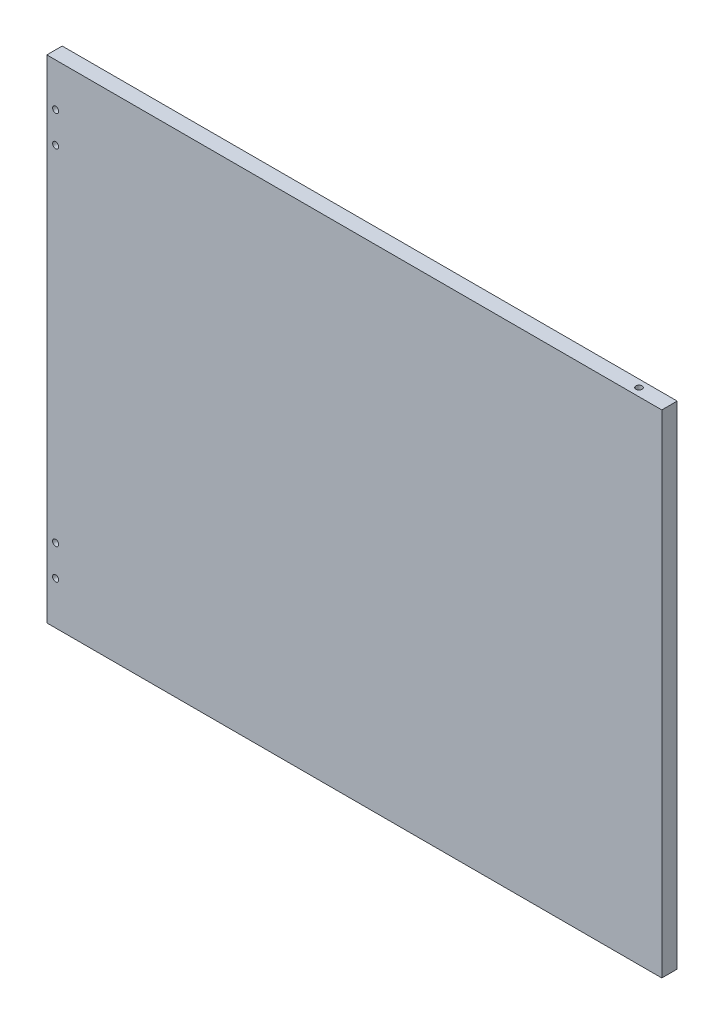
ISO-10303-21;
HEADER;
FILE_DESCRIPTION(('STEP AP214'),'2;1');
FILE_NAME('part.step','',(''),(''),'','','');
FILE_SCHEMA(('AUTOMOTIVE_DESIGN { 1 0 10303 214 1 1 1 1 }'));
ENDSEC;
DATA;
#1=APPLICATION_CONTEXT('core data for automotive mechanical design processes');
#2=APPLICATION_PROTOCOL_DEFINITION('international standard','automotive_design',2000,#1);
#3=PRODUCT_CONTEXT('',#1,'mechanical');
#4=PRODUCT('Part','Part','',(#3));
#5=PRODUCT_RELATED_PRODUCT_CATEGORY('part','',(#4));
#6=PRODUCT_DEFINITION_FORMATION('','',#4);
#7=PRODUCT_DEFINITION_CONTEXT('part definition',#1,'design');
#8=PRODUCT_DEFINITION('design','',#6,#7);
#9=PRODUCT_DEFINITION_SHAPE('','',#8);
#10=(LENGTH_UNIT() NAMED_UNIT(*) SI_UNIT(.MILLI.,.METRE.));
#11=(NAMED_UNIT(*) PLANE_ANGLE_UNIT() SI_UNIT($,.RADIAN.));
#12=(NAMED_UNIT(*) SI_UNIT($,.STERADIAN.) SOLID_ANGLE_UNIT());
#13=UNCERTAINTY_MEASURE_WITH_UNIT(LENGTH_MEASURE(1.E-05),#10,'distance_accuracy_value','');
#14=(GEOMETRIC_REPRESENTATION_CONTEXT(3) GLOBAL_UNCERTAINTY_ASSIGNED_CONTEXT((#13)) GLOBAL_UNIT_ASSIGNED_CONTEXT((#10,
#11,#12)) REPRESENTATION_CONTEXT('',''));
#15=CARTESIAN_POINT('',(0.,0.,0.));
#16=DIRECTION('',(0.,0.,1.));
#17=DIRECTION('',(1.,0.,0.));
#18=AXIS2_PLACEMENT_3D('',#15,#16,#17);
#19=CARTESIAN_POINT('',(0.,0.,25.));
#20=DIRECTION('',(1.,0.,0.));
#21=DIRECTION('',(0.,0.,-1.));
#22=AXIS2_PLACEMENT_3D('',#19,#20,#21);
#23=PLANE('',#22);
#24=DIRECTION('',(0.,-1.,0.));
#25=VECTOR('',#24,1.);
#26=CARTESIAN_POINT('',(0.,0.,0.));
#27=LINE('',#26,#25);
#28=CARTESIAN_POINT('',(0.,800.,0.));
#29=VERTEX_POINT('',#28);
#30=CARTESIAN_POINT('',(0.,0.,0.));
#31=VERTEX_POINT('',#30);
#32=EDGE_CURVE('E95',#29,#31,#27,.T.);
#33=ORIENTED_EDGE('',*,*,#32,.T.);
#34=DIRECTION('',(0.,0.,-1.));
#35=VECTOR('',#34,1.);
#36=CARTESIAN_POINT('',(0.,0.,25.));
#37=LINE('',#36,#35);
#38=CARTESIAN_POINT('',(0.,0.,25.));
#39=VERTEX_POINT('',#38);
#40=EDGE_CURVE('E11',#39,#31,#37,.T.);
#41=ORIENTED_EDGE('',*,*,#40,.F.);
#42=DIRECTION('',(0.,-1.,0.));
#43=VECTOR('',#42,1.);
#44=CARTESIAN_POINT('',(0.,0.,25.));
#45=LINE('',#44,#43);
#46=CARTESIAN_POINT('',(0.,800.,25.));
#47=VERTEX_POINT('',#46);
#48=EDGE_CURVE('E83',#47,#39,#45,.T.);
#49=ORIENTED_EDGE('',*,*,#48,.F.);
#50=DIRECTION('',(0.,0.,-1.));
#51=VECTOR('',#50,1.);
#52=CARTESIAN_POINT('',(0.,800.,25.));
#53=LINE('',#52,#51);
#54=EDGE_CURVE('E91',#47,#29,#53,.T.);
#55=ORIENTED_EDGE('',*,*,#54,.T.);
#56=EDGE_LOOP('',(#33,#41,#49,#55));
#57=FACE_BOUND('',#56,.T.);
#58=ADVANCED_FACE('F32',(#57),#23,.F.);
#59=CARTESIAN_POINT('',(0.,0.,25.));
#60=DIRECTION('',(0.,1.,0.));
#61=DIRECTION('',(0.,0.,1.));
#62=AXIS2_PLACEMENT_3D('',#59,#60,#61);
#63=PLANE('',#62);
#64=CARTESIAN_POINT('',(950.,0.,12.));
#65=DIRECTION('',(0.,1.,0.));
#66=DIRECTION('',(0.,0.,1.));
#67=AXIS2_PLACEMENT_3D('',#64,#65,#66);
#68=CIRCLE('',#67,5.00000000000004);
#69=CARTESIAN_POINT('',(950.,0.,17.));
#70=VERTEX_POINT('',#69);
#71=EDGE_CURVE('E133',#70,#70,#68,.T.);
#72=ORIENTED_EDGE('',*,*,#71,.T.);
#73=EDGE_LOOP('',(#72));
#74=FACE_BOUND('',#73,.T.);
#75=DIRECTION('',(1.,0.,0.));
#76=VECTOR('',#75,1.);
#77=CARTESIAN_POINT('',(0.,0.,0.));
#78=LINE('',#77,#76);
#79=CARTESIAN_POINT('',(1000.,0.,0.));
#80=VERTEX_POINT('',#79);
#81=EDGE_CURVE('E87',#31,#80,#78,.T.);
#82=ORIENTED_EDGE('',*,*,#81,.T.);
#83=DIRECTION('',(0.,0.,-1.));
#84=VECTOR('',#83,1.);
#85=CARTESIAN_POINT('',(1000.,0.,25.));
#86=LINE('',#85,#84);
#87=CARTESIAN_POINT('',(1000.,0.,25.));
#88=VERTEX_POINT('',#87);
#89=EDGE_CURVE('E40',#88,#80,#86,.T.);
#90=ORIENTED_EDGE('',*,*,#89,.F.);
#91=DIRECTION('',(1.,0.,0.));
#92=VECTOR('',#91,1.);
#93=CARTESIAN_POINT('',(0.,0.,25.));
#94=LINE('',#93,#92);
#95=EDGE_CURVE('E78',#39,#88,#94,.T.);
#96=ORIENTED_EDGE('',*,*,#95,.F.);
#97=ORIENTED_EDGE('',*,*,#40,.T.);
#98=EDGE_LOOP('',(#82,#90,#96,#97));
#99=FACE_BOUND('',#98,.T.);
#100=ADVANCED_FACE('F86',(#74,#99),#63,.F.);
#101=CARTESIAN_POINT('',(1000.,0.,25.));
#102=DIRECTION('',(-1.,0.,0.));
#103=DIRECTION('',(0.,0.,1.));
#104=AXIS2_PLACEMENT_3D('',#101,#102,#103);
#105=PLANE('',#104);
#106=DIRECTION('',(0.,1.,0.));
#107=VECTOR('',#106,1.);
#108=CARTESIAN_POINT('',(1000.,0.,0.));
#109=LINE('',#108,#107);
#110=CARTESIAN_POINT('',(1000.,800.,0.));
#111=VERTEX_POINT('',#110);
#112=EDGE_CURVE('E65',#80,#111,#109,.T.);
#113=ORIENTED_EDGE('',*,*,#112,.T.);
#114=DIRECTION('',(0.,0.,-1.));
#115=VECTOR('',#114,1.);
#116=CARTESIAN_POINT('',(1000.,800.,25.));
#117=LINE('',#116,#115);
#118=CARTESIAN_POINT('',(1000.,800.,25.));
#119=VERTEX_POINT('',#118);
#120=EDGE_CURVE('E88',#119,#111,#117,.T.);
#121=ORIENTED_EDGE('',*,*,#120,.F.);
#122=DIRECTION('',(0.,1.,0.));
#123=VECTOR('',#122,1.);
#124=CARTESIAN_POINT('',(1000.,0.,25.));
#125=LINE('',#124,#123);
#126=EDGE_CURVE('E81',#88,#119,#125,.T.);
#127=ORIENTED_EDGE('',*,*,#126,.F.);
#128=ORIENTED_EDGE('',*,*,#89,.T.);
#129=EDGE_LOOP('',(#113,#121,#127,#128));
#130=FACE_BOUND('',#129,.T.);
#131=ADVANCED_FACE('F89',(#130),#105,.F.);
#132=CARTESIAN_POINT('',(0.,800.,25.));
#133=DIRECTION('',(0.,-1.,0.));
#134=DIRECTION('',(0.,0.,-1.));
#135=AXIS2_PLACEMENT_3D('',#132,#133,#134);
#136=PLANE('',#135);
#137=CARTESIAN_POINT('',(950.,800.,12.));
#138=DIRECTION('',(0.,1.,0.));
#139=DIRECTION('',(0.,0.,1.));
#140=AXIS2_PLACEMENT_3D('',#137,#138,#139);
#141=CIRCLE('',#140,5.00000000000004);
#142=CARTESIAN_POINT('',(950.,800.,17.));
#143=VERTEX_POINT('',#142);
#144=EDGE_CURVE('E139',#143,#143,#141,.T.);
#145=ORIENTED_EDGE('',*,*,#144,.F.);
#146=EDGE_LOOP('',(#145));
#147=FACE_BOUND('',#146,.T.);
#148=DIRECTION('',(-1.,0.,0.));
#149=VECTOR('',#148,1.);
#150=CARTESIAN_POINT('',(0.,800.,0.));
#151=LINE('',#150,#149);
#152=EDGE_CURVE('E71',#111,#29,#151,.T.);
#153=ORIENTED_EDGE('',*,*,#152,.T.);
#154=ORIENTED_EDGE('',*,*,#54,.F.);
#155=DIRECTION('',(-1.,0.,0.));
#156=VECTOR('',#155,1.);
#157=CARTESIAN_POINT('',(0.,800.,25.));
#158=LINE('',#157,#156);
#159=EDGE_CURVE('E48',#119,#47,#158,.T.);
#160=ORIENTED_EDGE('',*,*,#159,.F.);
#161=ORIENTED_EDGE('',*,*,#120,.T.);
#162=EDGE_LOOP('',(#153,#154,#160,#161));
#163=FACE_BOUND('',#162,.T.);
#164=ADVANCED_FACE('F103',(#147,#163),#136,.F.);
#165=CARTESIAN_POINT('',(0.,0.,25.));
#166=DIRECTION('',(0.,0.,-1.));
#167=DIRECTION('',(-1.,0.,0.));
#168=AXIS2_PLACEMENT_3D('',#165,#166,#167);
#169=PLANE('',#168);
#170=CARTESIAN_POINT('',(14.35,730.,25.));
#171=DIRECTION('',(0.,0.,1.));
#172=DIRECTION('',(1.,0.,0.));
#173=AXIS2_PLACEMENT_3D('',#170,#171,#172);
#174=CIRCLE('',#173,5.00000000000001);
#175=CARTESIAN_POINT('',(19.35,730.,25.));
#176=VERTEX_POINT('',#175);
#177=EDGE_CURVE('E98',#176,#176,#174,.T.);
#178=ORIENTED_EDGE('',*,*,#177,.F.);
#179=EDGE_LOOP('',(#178));
#180=FACE_BOUND('',#179,.T.);
#181=CARTESIAN_POINT('',(14.35,120.,25.));
#182=DIRECTION('',(0.,0.,1.));
#183=DIRECTION('',(1.,0.,0.));
#184=AXIS2_PLACEMENT_3D('',#181,#182,#183);
#185=CIRCLE('',#184,5.00000000000001);
#186=CARTESIAN_POINT('',(19.35,120.,25.));
#187=VERTEX_POINT('',#186);
#188=EDGE_CURVE('E113',#187,#187,#185,.T.);
#189=ORIENTED_EDGE('',*,*,#188,.F.);
#190=EDGE_LOOP('',(#189));
#191=FACE_BOUND('',#190,.T.);
#192=CARTESIAN_POINT('',(14.35,70.,25.));
#193=DIRECTION('',(0.,0.,1.));
#194=DIRECTION('',(1.,0.,0.));
#195=AXIS2_PLACEMENT_3D('',#192,#193,#194);
#196=CIRCLE('',#195,5.00000000000001);
#197=CARTESIAN_POINT('',(19.35,70.,25.));
#198=VERTEX_POINT('',#197);
#199=EDGE_CURVE('E112',#198,#198,#196,.T.);
#200=ORIENTED_EDGE('',*,*,#199,.F.);
#201=EDGE_LOOP('',(#200));
#202=FACE_BOUND('',#201,.T.);
#203=CARTESIAN_POINT('',(14.3500000000001,680.,25.));
#204=DIRECTION('',(0.,0.,1.));
#205=DIRECTION('',(1.,0.,0.));
#206=AXIS2_PLACEMENT_3D('',#203,#204,#205);
#207=CIRCLE('',#206,5.00000000000001);
#208=CARTESIAN_POINT('',(19.3500000000001,680.,25.));
#209=VERTEX_POINT('',#208);
#210=EDGE_CURVE('E119',#209,#209,#207,.T.);
#211=ORIENTED_EDGE('',*,*,#210,.F.);
#212=EDGE_LOOP('',(#211));
#213=FACE_BOUND('',#212,.T.);
#214=ORIENTED_EDGE('',*,*,#48,.T.);
#215=ORIENTED_EDGE('',*,*,#95,.T.);
#216=ORIENTED_EDGE('',*,*,#126,.T.);
#217=ORIENTED_EDGE('',*,*,#159,.T.);
#218=EDGE_LOOP('',(#214,#215,#216,#217));
#219=FACE_BOUND('',#218,.T.);
#220=ADVANCED_FACE('F79',(#180,#191,#202,#213,#219),#169,.F.);
#221=CARTESIAN_POINT('',(0.,0.,0.));
#222=DIRECTION('',(0.,0.,-1.));
#223=DIRECTION('',(-1.,0.,0.));
#224=AXIS2_PLACEMENT_3D('',#221,#222,#223);
#225=PLANE('',#224);
#226=CARTESIAN_POINT('',(14.35,730.,0.));
#227=DIRECTION('',(0.,0.,1.));
#228=DIRECTION('',(1.,0.,0.));
#229=AXIS2_PLACEMENT_3D('',#226,#227,#228);
#230=CIRCLE('',#229,5.00000000000001);
#231=CARTESIAN_POINT('',(19.35,730.,0.));
#232=VERTEX_POINT('',#231);
#233=EDGE_CURVE('E122',#232,#232,#230,.T.);
#234=ORIENTED_EDGE('',*,*,#233,.T.);
#235=EDGE_LOOP('',(#234));
#236=FACE_BOUND('',#235,.T.);
#237=CARTESIAN_POINT('',(14.35,120.,0.));
#238=DIRECTION('',(0.,0.,1.));
#239=DIRECTION('',(1.,0.,0.));
#240=AXIS2_PLACEMENT_3D('',#237,#238,#239);
#241=CIRCLE('',#240,5.00000000000001);
#242=CARTESIAN_POINT('',(19.35,120.,0.));
#243=VERTEX_POINT('',#242);
#244=EDGE_CURVE('E123',#243,#243,#241,.T.);
#245=ORIENTED_EDGE('',*,*,#244,.T.);
#246=EDGE_LOOP('',(#245));
#247=FACE_BOUND('',#246,.T.);
#248=CARTESIAN_POINT('',(14.35,70.,0.));
#249=DIRECTION('',(0.,0.,1.));
#250=DIRECTION('',(1.,0.,0.));
#251=AXIS2_PLACEMENT_3D('',#248,#249,#250);
#252=CIRCLE('',#251,5.00000000000001);
#253=CARTESIAN_POINT('',(19.35,70.,0.));
#254=VERTEX_POINT('',#253);
#255=EDGE_CURVE('E109',#254,#254,#252,.T.);
#256=ORIENTED_EDGE('',*,*,#255,.T.);
#257=EDGE_LOOP('',(#256));
#258=FACE_BOUND('',#257,.T.);
#259=CARTESIAN_POINT('',(14.3500000000001,680.,0.));
#260=DIRECTION('',(0.,0.,1.));
#261=DIRECTION('',(1.,0.,0.));
#262=AXIS2_PLACEMENT_3D('',#259,#260,#261);
#263=CIRCLE('',#262,5.00000000000001);
#264=CARTESIAN_POINT('',(19.3500000000001,680.,0.));
#265=VERTEX_POINT('',#264);
#266=EDGE_CURVE('E116',#265,#265,#263,.T.);
#267=ORIENTED_EDGE('',*,*,#266,.T.);
#268=EDGE_LOOP('',(#267));
#269=FACE_BOUND('',#268,.T.);
#270=ORIENTED_EDGE('',*,*,#32,.F.);
#271=ORIENTED_EDGE('',*,*,#152,.F.);
#272=ORIENTED_EDGE('',*,*,#112,.F.);
#273=ORIENTED_EDGE('',*,*,#81,.F.);
#274=EDGE_LOOP('',(#270,#271,#272,#273));
#275=FACE_BOUND('',#274,.T.);
#276=ADVANCED_FACE('F106',(#236,#247,#258,#269,#275),#225,.T.);
#277=CARTESIAN_POINT('',(14.3500000000001,680.,25.));
#278=DIRECTION('',(0.,0.,-1.));
#279=DIRECTION('',(-1.,0.,0.));
#280=AXIS2_PLACEMENT_3D('',#277,#278,#279);
#281=CYLINDRICAL_SURFACE('',#280,5.00000000000001);
#282=ORIENTED_EDGE('',*,*,#210,.T.);
#283=EDGE_LOOP('',(#282));
#284=FACE_BOUND('',#283,.T.);
#285=ORIENTED_EDGE('',*,*,#266,.F.);
#286=EDGE_LOOP('',(#285));
#287=FACE_BOUND('',#286,.T.);
#288=ADVANCED_FACE('F192',(#284,#287),#281,.F.);
#289=CARTESIAN_POINT('',(14.35,70.,25.));
#290=DIRECTION('',(0.,0.,-1.));
#291=DIRECTION('',(-1.,0.,0.));
#292=AXIS2_PLACEMENT_3D('',#289,#290,#291);
#293=CYLINDRICAL_SURFACE('',#292,5.00000000000001);
#294=ORIENTED_EDGE('',*,*,#199,.T.);
#295=EDGE_LOOP('',(#294));
#296=FACE_BOUND('',#295,.T.);
#297=ORIENTED_EDGE('',*,*,#255,.F.);
#298=EDGE_LOOP('',(#297));
#299=FACE_BOUND('',#298,.T.);
#300=ADVANCED_FACE('F190',(#296,#299),#293,.F.);
#301=CARTESIAN_POINT('',(14.35,120.,25.));
#302=DIRECTION('',(0.,0.,-1.));
#303=DIRECTION('',(-1.,0.,0.));
#304=AXIS2_PLACEMENT_3D('',#301,#302,#303);
#305=CYLINDRICAL_SURFACE('',#304,5.00000000000001);
#306=ORIENTED_EDGE('',*,*,#188,.T.);
#307=EDGE_LOOP('',(#306));
#308=FACE_BOUND('',#307,.T.);
#309=ORIENTED_EDGE('',*,*,#244,.F.);
#310=EDGE_LOOP('',(#309));
#311=FACE_BOUND('',#310,.T.);
#312=ADVANCED_FACE('F184',(#308,#311),#305,.F.);
#313=CARTESIAN_POINT('',(14.35,730.,25.));
#314=DIRECTION('',(0.,0.,-1.));
#315=DIRECTION('',(-1.,0.,0.));
#316=AXIS2_PLACEMENT_3D('',#313,#314,#315);
#317=CYLINDRICAL_SURFACE('',#316,5.00000000000001);
#318=ORIENTED_EDGE('',*,*,#177,.T.);
#319=EDGE_LOOP('',(#318));
#320=FACE_BOUND('',#319,.T.);
#321=ORIENTED_EDGE('',*,*,#233,.F.);
#322=EDGE_LOOP('',(#321));
#323=FACE_BOUND('',#322,.T.);
#324=ADVANCED_FACE('F175',(#320,#323),#317,.F.);
#325=CARTESIAN_POINT('',(950.,40.,12.));
#326=DIRECTION('',(0.,-1.,0.));
#327=DIRECTION('',(0.,0.,-1.));
#328=AXIS2_PLACEMENT_3D('',#325,#326,#327);
#329=CYLINDRICAL_SURFACE('',#328,5.00000000000004);
#330=CARTESIAN_POINT('',(950.,40.,12.));
#331=DIRECTION('',(0.,1.,0.));
#332=DIRECTION('',(0.,0.,1.));
#333=AXIS2_PLACEMENT_3D('',#330,#331,#332);
#334=CIRCLE('',#333,5.00000000000004);
#335=CARTESIAN_POINT('',(950.,40.,17.));
#336=VERTEX_POINT('',#335);
#337=EDGE_CURVE('E126',#336,#336,#334,.T.);
#338=ORIENTED_EDGE('',*,*,#337,.T.);
#339=EDGE_LOOP('',(#338));
#340=FACE_BOUND('',#339,.T.);
#341=ORIENTED_EDGE('',*,*,#71,.F.);
#342=EDGE_LOOP('',(#341));
#343=FACE_BOUND('',#342,.T.);
#344=ADVANCED_FACE('F173',(#340,#343),#329,.F.);
#345=CARTESIAN_POINT('',(950.,40.,12.));
#346=DIRECTION('',(0.,1.,0.));
#347=DIRECTION('',(0.,0.,1.));
#348=AXIS2_PLACEMENT_3D('',#345,#346,#347);
#349=PLANE('',#348);
#350=ORIENTED_EDGE('',*,*,#337,.F.);
#351=EDGE_LOOP('',(#350));
#352=FACE_BOUND('',#351,.T.);
#353=ADVANCED_FACE('F150',(#352),#349,.F.);
#354=CARTESIAN_POINT('',(950.,760.,12.));
#355=DIRECTION('',(0.,1.,0.));
#356=DIRECTION('',(0.,0.,1.));
#357=AXIS2_PLACEMENT_3D('',#354,#355,#356);
#358=CYLINDRICAL_SURFACE('',#357,5.00000000000004);
#359=CARTESIAN_POINT('',(950.,760.,12.));
#360=DIRECTION('',(0.,1.,0.));
#361=DIRECTION('',(0.,0.,1.));
#362=AXIS2_PLACEMENT_3D('',#359,#360,#361);
#363=CIRCLE('',#362,5.00000000000004);
#364=CARTESIAN_POINT('',(950.,760.,17.));
#365=VERTEX_POINT('',#364);
#366=EDGE_CURVE('E136',#365,#365,#363,.T.);
#367=ORIENTED_EDGE('',*,*,#366,.F.);
#368=EDGE_LOOP('',(#367));
#369=FACE_BOUND('',#368,.T.);
#370=ORIENTED_EDGE('',*,*,#144,.T.);
#371=EDGE_LOOP('',(#370));
#372=FACE_BOUND('',#371,.T.);
#373=ADVANCED_FACE('F147',(#369,#372),#358,.F.);
#374=CARTESIAN_POINT('',(950.,760.,12.));
#375=DIRECTION('',(0.,-1.,0.));
#376=DIRECTION('',(0.,0.,1.));
#377=AXIS2_PLACEMENT_3D('',#374,#375,#376);
#378=PLANE('',#377);
#379=ORIENTED_EDGE('',*,*,#366,.T.);
#380=EDGE_LOOP('',(#379));
#381=FACE_BOUND('',#380,.T.);
#382=ADVANCED_FACE('F145',(#381),#378,.F.);
#383=CLOSED_SHELL('',(#58,#100,#131,#164,#220,#276,#288,#300,#312,#324,#344,#353,#373,#382));
#384=MANIFOLD_SOLID_BREP('B2',#383);
#385=ADVANCED_BREP_SHAPE_REPRESENTATION('',(#18,#384),#14);
#386=SHAPE_DEFINITION_REPRESENTATION(#9,#385);
ENDSEC;
END-ISO-10303-21;
